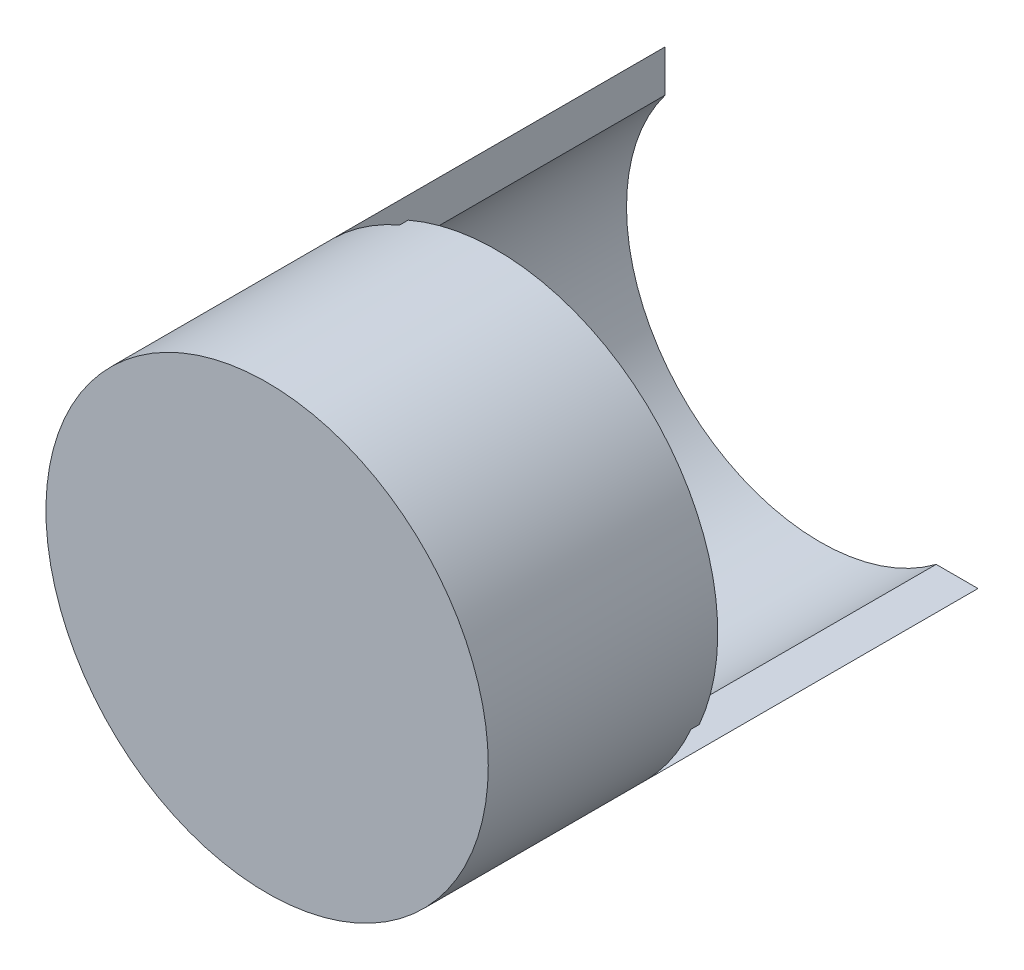
ISO-10303-21;
HEADER;
FILE_DESCRIPTION(('STEP AP214'),'2;1');
FILE_NAME('part.step','',(''),(''),'','','');
FILE_SCHEMA(('AUTOMOTIVE_DESIGN { 1 0 10303 214 1 1 1 1 }'));
ENDSEC;
DATA;
#1=APPLICATION_CONTEXT('core data for automotive mechanical design processes');
#2=APPLICATION_PROTOCOL_DEFINITION('international standard','automotive_design',2000,#1);
#3=PRODUCT_CONTEXT('',#1,'mechanical');
#4=PRODUCT('Part','Part','',(#3));
#5=PRODUCT_RELATED_PRODUCT_CATEGORY('part','',(#4));
#6=PRODUCT_DEFINITION_FORMATION('','',#4);
#7=PRODUCT_DEFINITION_CONTEXT('part definition',#1,'design');
#8=PRODUCT_DEFINITION('design','',#6,#7);
#9=PRODUCT_DEFINITION_SHAPE('','',#8);
#10=(LENGTH_UNIT() NAMED_UNIT(*) SI_UNIT(.MILLI.,.METRE.));
#11=(NAMED_UNIT(*) PLANE_ANGLE_UNIT() SI_UNIT($,.RADIAN.));
#12=(NAMED_UNIT(*) SI_UNIT($,.STERADIAN.) SOLID_ANGLE_UNIT());
#13=UNCERTAINTY_MEASURE_WITH_UNIT(LENGTH_MEASURE(1.E-05),#10,'distance_accuracy_value','');
#14=(GEOMETRIC_REPRESENTATION_CONTEXT(3) GLOBAL_UNCERTAINTY_ASSIGNED_CONTEXT((#13)) GLOBAL_UNIT_ASSIGNED_CONTEXT((#10,
#11,#12)) REPRESENTATION_CONTEXT('',''));
#15=CARTESIAN_POINT('',(0.,0.,0.));
#16=DIRECTION('',(0.,0.,1.));
#17=DIRECTION('',(1.,0.,0.));
#18=AXIS2_PLACEMENT_3D('',#15,#16,#17);
#19=CARTESIAN_POINT('',(0.,0.,0.));
#20=DIRECTION('',(0.,0.,1.));
#21=DIRECTION('',(1.,0.,0.));
#22=AXIS2_PLACEMENT_3D('',#19,#20,#21);
#23=PLANE('',#22);
#24=DIRECTION('',(-1.,0.,0.));
#25=VECTOR('',#24,1.);
#26=CARTESIAN_POINT('',(46.5589690607513,-20.3200000000001,0.));
#27=LINE('',#26,#25);
#28=CARTESIAN_POINT('',(46.5589690607513,-20.3200000000001,0.));
#29=VERTEX_POINT('',#28);
#30=CARTESIAN_POINT('',(39.5335313373343,-20.3200000000001,0.));
#31=VERTEX_POINT('',#30);
#32=EDGE_CURVE('E184',#29,#31,#27,.T.);
#33=ORIENTED_EDGE('',*,*,#32,.F.);
#34=CARTESIAN_POINT('',(0.,0.,0.));
#35=DIRECTION('',(0.,0.,1.));
#36=DIRECTION('',(1.,0.,0.));
#37=AXIS2_PLACEMENT_3D('',#34,#35,#36);
#38=CIRCLE('',#37,50.8);
#39=CARTESIAN_POINT('',(36.2784564169977,-35.56,0.));
#40=VERTEX_POINT('',#39);
#41=EDGE_CURVE('E45',#40,#29,#38,.T.);
#42=ORIENTED_EDGE('',*,*,#41,.F.);
#43=DIRECTION('',(1.,0.,0.));
#44=VECTOR('',#43,1.);
#45=CARTESIAN_POINT('',(36.2784564169977,-35.56,0.));
#46=LINE('',#45,#44);
#47=CARTESIAN_POINT('',(26.67,-35.56,0.));
#48=VERTEX_POINT('',#47);
#49=EDGE_CURVE('E128',#48,#40,#46,.T.);
#50=ORIENTED_EDGE('',*,*,#49,.F.);
#51=CARTESIAN_POINT('',(0.,0.,0.));
#52=DIRECTION('',(0.,0.,-1.));
#53=DIRECTION('',(-1.,0.,0.));
#54=AXIS2_PLACEMENT_3D('',#51,#52,#53);
#55=CIRCLE('',#54,44.45);
#56=EDGE_CURVE('E155',#31,#48,#55,.T.);
#57=ORIENTED_EDGE('',*,*,#56,.F.);
#58=EDGE_LOOP('',(#33,#42,#50,#57));
#59=FACE_BOUND('',#58,.T.);
#60=ADVANCED_FACE('F41',(#59),#23,.F.);
#61=DIRECTION('',(0.,1.,0.));
#62=VECTOR('',#61,1.);
#63=CARTESIAN_POINT('',(-20.32,39.5335313373344,0.));
#64=LINE('',#63,#62);
#65=CARTESIAN_POINT('',(-20.32,39.5335313373344,0.));
#66=VERTEX_POINT('',#65);
#67=CARTESIAN_POINT('',(-20.32,46.5589690607513,0.));
#68=VERTEX_POINT('',#67);
#69=EDGE_CURVE('E122',#66,#68,#64,.T.);
#70=ORIENTED_EDGE('',*,*,#69,.F.);
#71=CARTESIAN_POINT('',(-35.56,26.67,0.));
#72=VERTEX_POINT('',#71);
#73=EDGE_CURVE('E156',#72,#66,#55,.T.);
#74=ORIENTED_EDGE('',*,*,#73,.F.);
#75=DIRECTION('',(0.,-1.,0.));
#76=VECTOR('',#75,1.);
#77=CARTESIAN_POINT('',(-35.56,26.67,0.));
#78=LINE('',#77,#76);
#79=CARTESIAN_POINT('',(-35.56,36.2784564169977,0.));
#80=VERTEX_POINT('',#79);
#81=EDGE_CURVE('E125',#80,#72,#78,.T.);
#82=ORIENTED_EDGE('',*,*,#81,.F.);
#83=EDGE_CURVE('E161',#68,#80,#38,.T.);
#84=ORIENTED_EDGE('',*,*,#83,.F.);
#85=EDGE_LOOP('',(#70,#74,#82,#84));
#86=FACE_BOUND('',#85,.T.);
#87=ADVANCED_FACE('F171',(#86),#23,.F.);
#88=CARTESIAN_POINT('',(0.,0.,50.8));
#89=DIRECTION('',(0.,0.,-1.));
#90=DIRECTION('',(-1.,0.,0.));
#91=AXIS2_PLACEMENT_3D('',#88,#89,#90);
#92=CYLINDRICAL_SURFACE('',#91,50.8);
#93=CARTESIAN_POINT('',(0.,0.,50.8));
#94=DIRECTION('',(0.,0.,1.));
#95=DIRECTION('',(1.,0.,0.));
#96=AXIS2_PLACEMENT_3D('',#93,#94,#95);
#97=CIRCLE('',#96,50.8);
#98=CARTESIAN_POINT('',(50.8,0.,50.8));
#99=VERTEX_POINT('',#98);
#100=EDGE_CURVE('E12',#99,#99,#97,.T.);
#101=ORIENTED_EDGE('',*,*,#100,.F.);
#102=EDGE_LOOP('',(#101));
#103=FACE_BOUND('',#102,.T.);
#104=ORIENTED_EDGE('',*,*,#41,.T.);
#105=DIRECTION('',(0.,0.,1.));
#106=VECTOR('',#105,1.);
#107=CARTESIAN_POINT('',(46.5589690607513,-20.3200000000001,-1.905));
#108=LINE('',#107,#106);
#109=CARTESIAN_POINT('',(46.5589690607513,-20.3200000000001,-1.905));
#110=VERTEX_POINT('',#109);
#111=EDGE_CURVE('E110',#110,#29,#108,.T.);
#112=ORIENTED_EDGE('',*,*,#111,.F.);
#113=CARTESIAN_POINT('',(0.,0.,-1.905));
#114=DIRECTION('',(0.,0.,-1.));
#115=DIRECTION('',(1.,0.,0.));
#116=AXIS2_PLACEMENT_3D('',#113,#114,#115);
#117=CIRCLE('',#116,50.8);
#118=CARTESIAN_POINT('',(-20.32,46.5589690607513,-1.905));
#119=VERTEX_POINT('',#118);
#120=EDGE_CURVE('E113',#119,#110,#117,.T.);
#121=ORIENTED_EDGE('',*,*,#120,.F.);
#122=DIRECTION('',(0.,0.,1.));
#123=VECTOR('',#122,1.);
#124=CARTESIAN_POINT('',(-20.32,46.5589690607513,-1.905));
#125=LINE('',#124,#123);
#126=EDGE_CURVE('E168',#119,#68,#125,.T.);
#127=ORIENTED_EDGE('',*,*,#126,.T.);
#128=ORIENTED_EDGE('',*,*,#83,.T.);
#129=DIRECTION('',(0.,0.,1.));
#130=VECTOR('',#129,1.);
#131=CARTESIAN_POINT('',(-35.56,36.2784564169977,-76.2));
#132=LINE('',#131,#130);
#133=CARTESIAN_POINT('',(-35.56,36.2784564169977,-76.2));
#134=VERTEX_POINT('',#133);
#135=EDGE_CURVE('E152',#134,#80,#132,.T.);
#136=ORIENTED_EDGE('',*,*,#135,.F.);
#137=CARTESIAN_POINT('',(0.,0.,-76.2));
#138=DIRECTION('',(0.,0.,-1.));
#139=DIRECTION('',(-1.,0.,0.));
#140=AXIS2_PLACEMENT_3D('',#137,#138,#139);
#141=CIRCLE('',#140,50.8);
#142=CARTESIAN_POINT('',(36.2784564169977,-35.56,-76.2));
#143=VERTEX_POINT('',#142);
#144=EDGE_CURVE('E134',#143,#134,#141,.T.);
#145=ORIENTED_EDGE('',*,*,#144,.F.);
#146=DIRECTION('',(0.,0.,1.));
#147=VECTOR('',#146,1.);
#148=CARTESIAN_POINT('',(36.2784564169977,-35.56,-76.2));
#149=LINE('',#148,#147);
#150=EDGE_CURVE('E142',#143,#40,#149,.T.);
#151=ORIENTED_EDGE('',*,*,#150,.T.);
#152=EDGE_LOOP('',(#104,#112,#121,#127,#128,#136,#145,#151));
#153=FACE_BOUND('',#152,.T.);
#154=ADVANCED_FACE('F43',(#103,#153),#92,.T.);
#155=CARTESIAN_POINT('',(0.,0.,50.8));
#156=DIRECTION('',(0.,0.,1.));
#157=DIRECTION('',(1.,0.,0.));
#158=AXIS2_PLACEMENT_3D('',#155,#156,#157);
#159=PLANE('',#158);
#160=ORIENTED_EDGE('',*,*,#100,.T.);
#161=EDGE_LOOP('',(#160));
#162=FACE_BOUND('',#161,.T.);
#163=ADVANCED_FACE('F209',(#162),#159,.T.);
#164=CARTESIAN_POINT('',(0.,0.,44.45));
#165=DIRECTION('',(0.,0.,1.));
#166=DIRECTION('',(1.,0.,0.));
#167=AXIS2_PLACEMENT_3D('',#164,#165,#166);
#168=PLANE('',#167);
#169=CARTESIAN_POINT('',(0.,0.,44.45));
#170=DIRECTION('',(0.,0.,1.));
#171=DIRECTION('',(1.,0.,0.));
#172=AXIS2_PLACEMENT_3D('',#169,#170,#171);
#173=CIRCLE('',#172,44.45);
#174=CARTESIAN_POINT('',(44.45,0.,44.45));
#175=VERTEX_POINT('',#174);
#176=EDGE_CURVE('E159',#175,#175,#173,.F.);
#177=ORIENTED_EDGE('',*,*,#176,.T.);
#178=EDGE_LOOP('',(#177));
#179=FACE_BOUND('',#178,.T.);
#180=ADVANCED_FACE('F212',(#179),#168,.F.);
#181=CARTESIAN_POINT('',(0.,0.,176.523585694968));
#182=DIRECTION('',(0.,0.,-1.));
#183=DIRECTION('',(-1.,0.,0.));
#184=AXIS2_PLACEMENT_3D('',#181,#182,#183);
#185=CYLINDRICAL_SURFACE('',#184,44.45);
#186=ORIENTED_EDGE('',*,*,#73,.T.);
#187=DIRECTION('',(0.,0.,1.));
#188=VECTOR('',#187,1.);
#189=CARTESIAN_POINT('',(-20.32,39.5335313373344,-1.905));
#190=LINE('',#189,#188);
#191=CARTESIAN_POINT('',(-20.32,39.5335313373344,-1.905));
#192=VERTEX_POINT('',#191);
#193=EDGE_CURVE('E130',#192,#66,#190,.T.);
#194=ORIENTED_EDGE('',*,*,#193,.F.);
#195=CARTESIAN_POINT('',(0.,0.,-1.905));
#196=DIRECTION('',(0.,0.,1.));
#197=DIRECTION('',(1.,0.,0.));
#198=AXIS2_PLACEMENT_3D('',#195,#196,#197);
#199=CIRCLE('',#198,44.45);
#200=CARTESIAN_POINT('',(39.5335313373343,-20.3200000000001,-1.905));
#201=VERTEX_POINT('',#200);
#202=EDGE_CURVE('E112',#201,#192,#199,.T.);
#203=ORIENTED_EDGE('',*,*,#202,.F.);
#204=DIRECTION('',(0.,0.,1.));
#205=VECTOR('',#204,1.);
#206=CARTESIAN_POINT('',(39.5335313373343,-20.3200000000001,-1.905));
#207=LINE('',#206,#205);
#208=EDGE_CURVE('E56',#201,#31,#207,.T.);
#209=ORIENTED_EDGE('',*,*,#208,.T.);
#210=ORIENTED_EDGE('',*,*,#56,.T.);
#211=DIRECTION('',(0.,0.,1.));
#212=VECTOR('',#211,1.);
#213=CARTESIAN_POINT('',(26.67,-35.56,-76.2));
#214=LINE('',#213,#212);
#215=CARTESIAN_POINT('',(26.67,-35.56,-76.2));
#216=VERTEX_POINT('',#215);
#217=EDGE_CURVE('E146',#216,#48,#214,.T.);
#218=ORIENTED_EDGE('',*,*,#217,.F.);
#219=CARTESIAN_POINT('',(0.,0.,-76.2));
#220=DIRECTION('',(0.,0.,1.));
#221=DIRECTION('',(-1.,0.,0.));
#222=AXIS2_PLACEMENT_3D('',#219,#220,#221);
#223=CIRCLE('',#222,44.45);
#224=CARTESIAN_POINT('',(-35.56,26.67,-76.2));
#225=VERTEX_POINT('',#224);
#226=EDGE_CURVE('E139',#225,#216,#223,.T.);
#227=ORIENTED_EDGE('',*,*,#226,.F.);
#228=DIRECTION('',(0.,0.,1.));
#229=VECTOR('',#228,1.);
#230=CARTESIAN_POINT('',(-35.56,26.67,-76.2));
#231=LINE('',#230,#229);
#232=EDGE_CURVE('E149',#225,#72,#231,.T.);
#233=ORIENTED_EDGE('',*,*,#232,.T.);
#234=EDGE_LOOP('',(#186,#194,#203,#209,#210,#218,#227,#233));
#235=FACE_BOUND('',#234,.T.);
#236=ORIENTED_EDGE('',*,*,#176,.F.);
#237=EDGE_LOOP('',(#236));
#238=FACE_BOUND('',#237,.T.);
#239=ADVANCED_FACE('F185',(#235,#238),#185,.F.);
#240=CARTESIAN_POINT('',(-35.56,26.67,-76.2));
#241=DIRECTION('',(-1.,0.,0.));
#242=DIRECTION('',(0.,-1.,0.));
#243=AXIS2_PLACEMENT_3D('',#240,#241,#242);
#244=PLANE('',#243);
#245=ORIENTED_EDGE('',*,*,#81,.T.);
#246=ORIENTED_EDGE('',*,*,#232,.F.);
#247=DIRECTION('',(0.,-1.,0.));
#248=VECTOR('',#247,1.);
#249=CARTESIAN_POINT('',(-35.56,26.67,-76.2));
#250=LINE('',#249,#248);
#251=EDGE_CURVE('E137',#134,#225,#250,.T.);
#252=ORIENTED_EDGE('',*,*,#251,.F.);
#253=ORIENTED_EDGE('',*,*,#135,.T.);
#254=EDGE_LOOP('',(#245,#246,#252,#253));
#255=FACE_BOUND('',#254,.T.);
#256=ADVANCED_FACE('F174',(#255),#244,.F.);
#257=CARTESIAN_POINT('',(36.2784564169977,-35.56,-76.2));
#258=DIRECTION('',(0.,-1.,0.));
#259=DIRECTION('',(0.,0.,-1.));
#260=AXIS2_PLACEMENT_3D('',#257,#258,#259);
#261=PLANE('',#260);
#262=ORIENTED_EDGE('',*,*,#49,.T.);
#263=ORIENTED_EDGE('',*,*,#150,.F.);
#264=DIRECTION('',(1.,0.,0.));
#265=VECTOR('',#264,1.);
#266=CARTESIAN_POINT('',(36.2784564169977,-35.56,-76.2));
#267=LINE('',#266,#265);
#268=EDGE_CURVE('E141',#216,#143,#267,.T.);
#269=ORIENTED_EDGE('',*,*,#268,.F.);
#270=ORIENTED_EDGE('',*,*,#217,.T.);
#271=EDGE_LOOP('',(#262,#263,#269,#270));
#272=FACE_BOUND('',#271,.T.);
#273=ADVANCED_FACE('F181',(#272),#261,.F.);
#274=CARTESIAN_POINT('',(0.,0.,-76.2));
#275=DIRECTION('',(0.,0.,-1.));
#276=DIRECTION('',(-1.,0.,0.));
#277=AXIS2_PLACEMENT_3D('',#274,#275,#276);
#278=PLANE('',#277);
#279=ORIENTED_EDGE('',*,*,#144,.T.);
#280=ORIENTED_EDGE('',*,*,#251,.T.);
#281=ORIENTED_EDGE('',*,*,#226,.T.);
#282=ORIENTED_EDGE('',*,*,#268,.T.);
#283=EDGE_LOOP('',(#279,#280,#281,#282));
#284=FACE_BOUND('',#283,.T.);
#285=ADVANCED_FACE('F177',(#284),#278,.T.);
#286=CARTESIAN_POINT('',(46.5589690607513,-20.3200000000001,-1.905));
#287=DIRECTION('',(0.,1.,0.));
#288=DIRECTION('',(0.,0.,1.));
#289=AXIS2_PLACEMENT_3D('',#286,#287,#288);
#290=PLANE('',#289);
#291=ORIENTED_EDGE('',*,*,#32,.T.);
#292=ORIENTED_EDGE('',*,*,#208,.F.);
#293=DIRECTION('',(-1.,0.,0.));
#294=VECTOR('',#293,1.);
#295=CARTESIAN_POINT('',(46.5589690607513,-20.3200000000001,-1.905));
#296=LINE('',#295,#294);
#297=EDGE_CURVE('E106',#110,#201,#296,.T.);
#298=ORIENTED_EDGE('',*,*,#297,.F.);
#299=ORIENTED_EDGE('',*,*,#111,.T.);
#300=EDGE_LOOP('',(#291,#292,#298,#299));
#301=FACE_BOUND('',#300,.T.);
#302=ADVANCED_FACE('F108',(#301),#290,.F.);
#303=CARTESIAN_POINT('',(-20.32,39.5335313373344,-1.905));
#304=DIRECTION('',(1.,0.,0.));
#305=DIRECTION('',(0.,0.,-1.));
#306=AXIS2_PLACEMENT_3D('',#303,#304,#305);
#307=PLANE('',#306);
#308=ORIENTED_EDGE('',*,*,#69,.T.);
#309=ORIENTED_EDGE('',*,*,#126,.F.);
#310=DIRECTION('',(0.,1.,0.));
#311=VECTOR('',#310,1.);
#312=CARTESIAN_POINT('',(-20.32,39.5335313373344,-1.905));
#313=LINE('',#312,#311);
#314=EDGE_CURVE('E118',#192,#119,#313,.T.);
#315=ORIENTED_EDGE('',*,*,#314,.F.);
#316=ORIENTED_EDGE('',*,*,#193,.T.);
#317=EDGE_LOOP('',(#308,#309,#315,#316));
#318=FACE_BOUND('',#317,.T.);
#319=ADVANCED_FACE('F189',(#318),#307,.F.);
#320=CARTESIAN_POINT('',(0.,0.,-1.905));
#321=DIRECTION('',(0.,0.,1.));
#322=DIRECTION('',(1.,0.,0.));
#323=AXIS2_PLACEMENT_3D('',#320,#321,#322);
#324=PLANE('',#323);
#325=ORIENTED_EDGE('',*,*,#120,.T.);
#326=ORIENTED_EDGE('',*,*,#297,.T.);
#327=ORIENTED_EDGE('',*,*,#202,.T.);
#328=ORIENTED_EDGE('',*,*,#314,.T.);
#329=EDGE_LOOP('',(#325,#326,#327,#328));
#330=FACE_BOUND('',#329,.T.);
#331=ADVANCED_FACE('F116',(#330),#324,.F.);
#332=CLOSED_SHELL('',(#60,#87,#154,#163,#180,#239,#256,#273,#285,#302,#319,#331));
#333=MANIFOLD_SOLID_BREP('B2',#332);
#334=ADVANCED_BREP_SHAPE_REPRESENTATION('',(#18,#333),#14);
#335=SHAPE_DEFINITION_REPRESENTATION(#9,#334);
ENDSEC;
END-ISO-10303-21;
